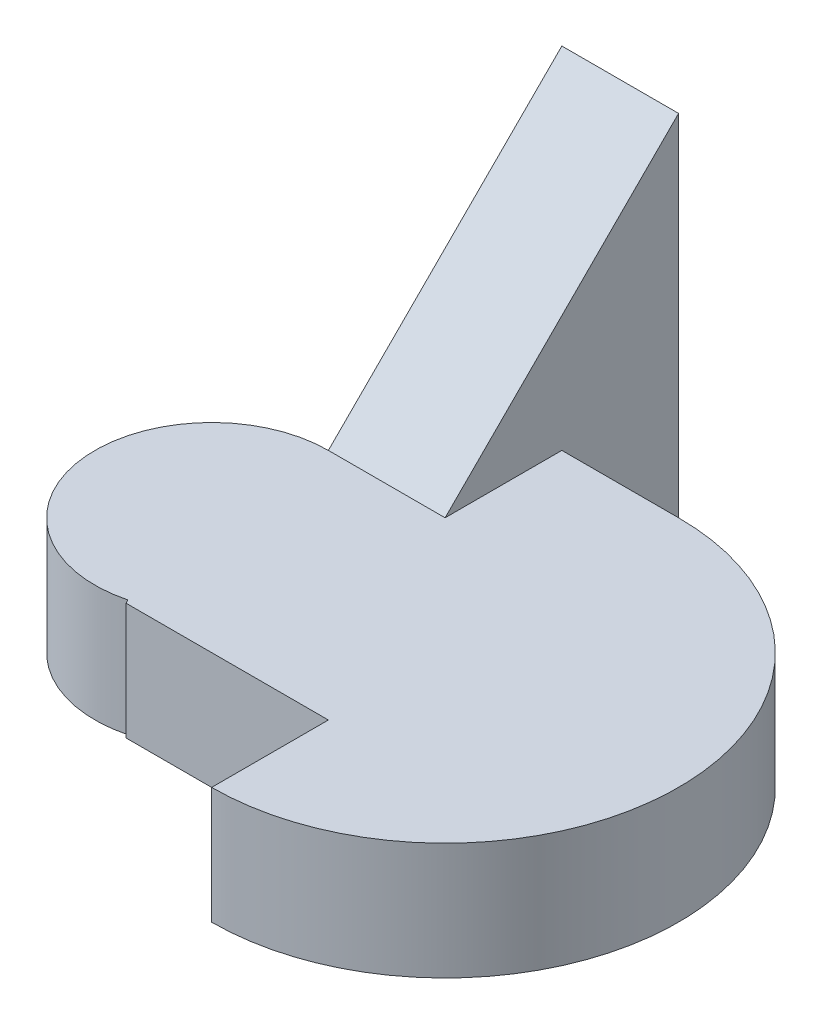
ISO-10303-21;
HEADER;
FILE_DESCRIPTION(('STEP AP214'),'2;1');
FILE_NAME('part.step','',(''),(''),'','','');
FILE_SCHEMA(('AUTOMOTIVE_DESIGN { 1 0 10303 214 1 1 1 1 }'));
ENDSEC;
DATA;
#1=APPLICATION_CONTEXT('core data for automotive mechanical design processes');
#2=APPLICATION_PROTOCOL_DEFINITION('international standard','automotive_design',2000,#1);
#3=PRODUCT_CONTEXT('',#1,'mechanical');
#4=PRODUCT('Part','Part','',(#3));
#5=PRODUCT_RELATED_PRODUCT_CATEGORY('part','',(#4));
#6=PRODUCT_DEFINITION_FORMATION('','',#4);
#7=PRODUCT_DEFINITION_CONTEXT('part definition',#1,'design');
#8=PRODUCT_DEFINITION('design','',#6,#7);
#9=PRODUCT_DEFINITION_SHAPE('','',#8);
#10=(LENGTH_UNIT() NAMED_UNIT(*) SI_UNIT(.MILLI.,.METRE.));
#11=(NAMED_UNIT(*) PLANE_ANGLE_UNIT() SI_UNIT($,.RADIAN.));
#12=(NAMED_UNIT(*) SI_UNIT($,.STERADIAN.) SOLID_ANGLE_UNIT());
#13=UNCERTAINTY_MEASURE_WITH_UNIT(LENGTH_MEASURE(1.E-05),#10,'distance_accuracy_value','');
#14=(GEOMETRIC_REPRESENTATION_CONTEXT(3) GLOBAL_UNCERTAINTY_ASSIGNED_CONTEXT((#13)) GLOBAL_UNIT_ASSIGNED_CONTEXT((#10,
#11,#12)) REPRESENTATION_CONTEXT('',''));
#15=CARTESIAN_POINT('',(0.,0.,0.));
#16=DIRECTION('',(0.,0.,1.));
#17=DIRECTION('',(1.,0.,0.));
#18=AXIS2_PLACEMENT_3D('',#15,#16,#17);
#19=CARTESIAN_POINT('',(-10.,10.,10.));
#20=DIRECTION('',(0.,-1.,0.));
#21=DIRECTION('',(0.,0.,-1.));
#22=AXIS2_PLACEMENT_3D('',#19,#20,#21);
#23=CYLINDRICAL_SURFACE('',#22,10.);
#24=CARTESIAN_POINT('',(-10.,0.,10.));
#25=DIRECTION('',(0.,1.,0.));
#26=DIRECTION('',(0.,0.,1.));
#27=AXIS2_PLACEMENT_3D('',#24,#25,#26);
#28=CIRCLE('',#27,10.);
#29=CARTESIAN_POINT('',(-10.,0.,0.));
#30=VERTEX_POINT('',#29);
#31=CARTESIAN_POINT('',(-7.5,0.,19.6824583655185));
#32=VERTEX_POINT('',#31);
#33=EDGE_CURVE('E129',#30,#32,#28,.T.);
#34=ORIENTED_EDGE('',*,*,#33,.T.);
#35=DIRECTION('',(0.,-1.,0.));
#36=VECTOR('',#35,1.);
#37=CARTESIAN_POINT('',(-7.5,10.,19.6824583655185));
#38=LINE('',#37,#36);
#39=CARTESIAN_POINT('',(-7.5,10.,19.6824583655185));
#40=VERTEX_POINT('',#39);
#41=EDGE_CURVE('E11',#40,#32,#38,.T.);
#42=ORIENTED_EDGE('',*,*,#41,.F.);
#43=CARTESIAN_POINT('',(-10.,10.,10.));
#44=DIRECTION('',(0.,1.,0.));
#45=DIRECTION('',(0.,0.,1.));
#46=AXIS2_PLACEMENT_3D('',#43,#44,#45);
#47=CIRCLE('',#46,10.);
#48=CARTESIAN_POINT('',(-10.,10.,0.));
#49=VERTEX_POINT('',#48);
#50=EDGE_CURVE('E141',#49,#40,#47,.T.);
#51=ORIENTED_EDGE('',*,*,#50,.F.);
#52=DIRECTION('',(0.,-1.,0.));
#53=VECTOR('',#52,1.);
#54=CARTESIAN_POINT('',(-10.,10.,0.));
#55=LINE('',#54,#53);
#56=EDGE_CURVE('E128',#49,#30,#55,.T.);
#57=ORIENTED_EDGE('',*,*,#56,.T.);
#58=EDGE_LOOP('',(#34,#42,#51,#57));
#59=FACE_BOUND('',#58,.T.);
#60=ADVANCED_FACE('F35',(#59),#23,.T.);
#61=CARTESIAN_POINT('',(10.,10.,10.));
#62=DIRECTION('',(0.,-1.,0.));
#63=DIRECTION('',(0.,0.,-1.));
#64=AXIS2_PLACEMENT_3D('',#61,#62,#63);
#65=CYLINDRICAL_SURFACE('',#64,20.);
#66=CARTESIAN_POINT('',(10.,0.,10.));
#67=DIRECTION('',(0.,1.,0.));
#68=DIRECTION('',(0.,0.,1.));
#69=AXIS2_PLACEMENT_3D('',#66,#67,#68);
#70=CIRCLE('',#69,20.);
#71=CARTESIAN_POINT('',(-7.32050807568877,0.,20.));
#72=VERTEX_POINT('',#71);
#73=EDGE_CURVE('E132',#32,#72,#70,.T.);
#74=ORIENTED_EDGE('',*,*,#73,.T.);
#75=DIRECTION('',(0.,-1.,0.));
#76=VECTOR('',#75,1.);
#77=CARTESIAN_POINT('',(-7.32050807568877,10.,20.));
#78=LINE('',#77,#76);
#79=CARTESIAN_POINT('',(-7.32050807568877,10.,20.));
#80=VERTEX_POINT('',#79);
#81=EDGE_CURVE('E43',#80,#72,#78,.T.);
#82=ORIENTED_EDGE('',*,*,#81,.F.);
#83=CARTESIAN_POINT('',(10.,10.,10.));
#84=DIRECTION('',(0.,1.,0.));
#85=DIRECTION('',(0.,0.,1.));
#86=AXIS2_PLACEMENT_3D('',#83,#84,#85);
#87=CIRCLE('',#86,20.);
#88=EDGE_CURVE('E84',#40,#80,#87,.T.);
#89=ORIENTED_EDGE('',*,*,#88,.F.);
#90=ORIENTED_EDGE('',*,*,#41,.T.);
#91=EDGE_LOOP('',(#74,#82,#89,#90));
#92=FACE_BOUND('',#91,.T.);
#93=ADVANCED_FACE('F186',(#92),#65,.T.);
#94=CARTESIAN_POINT('',(0.,10.,20.));
#95=DIRECTION('',(0.,0.,-1.));
#96=DIRECTION('',(-1.,0.,0.));
#97=AXIS2_PLACEMENT_3D('',#94,#95,#96);
#98=PLANE('',#97);
#99=DIRECTION('',(1.,0.,0.));
#100=VECTOR('',#99,1.);
#101=CARTESIAN_POINT('',(0.,0.,20.));
#102=LINE('',#101,#100);
#103=CARTESIAN_POINT('',(10.,0.,20.));
#104=VERTEX_POINT('',#103);
#105=EDGE_CURVE('E135',#72,#104,#102,.T.);
#106=ORIENTED_EDGE('',*,*,#105,.T.);
#107=DIRECTION('',(0.,-1.,0.));
#108=VECTOR('',#107,1.);
#109=CARTESIAN_POINT('',(10.,10.,20.));
#110=LINE('',#109,#108);
#111=CARTESIAN_POINT('',(10.,10.,20.));
#112=VERTEX_POINT('',#111);
#113=EDGE_CURVE('E114',#112,#104,#110,.T.);
#114=ORIENTED_EDGE('',*,*,#113,.F.);
#115=DIRECTION('',(1.,0.,0.));
#116=VECTOR('',#115,1.);
#117=CARTESIAN_POINT('',(0.,10.,20.));
#118=LINE('',#117,#116);
#119=EDGE_CURVE('E102',#80,#112,#118,.T.);
#120=ORIENTED_EDGE('',*,*,#119,.F.);
#121=ORIENTED_EDGE('',*,*,#81,.T.);
#122=EDGE_LOOP('',(#106,#114,#120,#121));
#123=FACE_BOUND('',#122,.T.);
#124=ADVANCED_FACE('F149',(#123),#98,.F.);
#125=CARTESIAN_POINT('',(10.,10.,0.));
#126=DIRECTION('',(1.,0.,0.));
#127=DIRECTION('',(0.,0.,-1.));
#128=AXIS2_PLACEMENT_3D('',#125,#126,#127);
#129=PLANE('',#128);
#130=DIRECTION('',(0.,0.,1.));
#131=VECTOR('',#130,1.);
#132=CARTESIAN_POINT('',(10.,0.,0.));
#133=LINE('',#132,#131);
#134=CARTESIAN_POINT('',(10.,0.,30.));
#135=VERTEX_POINT('',#134);
#136=EDGE_CURVE('E111',#104,#135,#133,.T.);
#137=ORIENTED_EDGE('',*,*,#136,.T.);
#138=DIRECTION('',(0.,-1.,0.));
#139=VECTOR('',#138,1.);
#140=CARTESIAN_POINT('',(10.,10.,30.));
#141=LINE('',#140,#139);
#142=CARTESIAN_POINT('',(10.,10.,30.));
#143=VERTEX_POINT('',#142);
#144=EDGE_CURVE('E108',#143,#135,#141,.T.);
#145=ORIENTED_EDGE('',*,*,#144,.F.);
#146=DIRECTION('',(0.,0.,1.));
#147=VECTOR('',#146,1.);
#148=CARTESIAN_POINT('',(10.,10.,0.));
#149=LINE('',#148,#147);
#150=EDGE_CURVE('E96',#112,#143,#149,.T.);
#151=ORIENTED_EDGE('',*,*,#150,.F.);
#152=ORIENTED_EDGE('',*,*,#113,.T.);
#153=EDGE_LOOP('',(#137,#145,#151,#152));
#154=FACE_BOUND('',#153,.T.);
#155=ADVANCED_FACE('F109',(#154),#129,.F.);
#156=CARTESIAN_POINT('',(10.,10.,10.));
#157=DIRECTION('',(0.,-1.,0.));
#158=DIRECTION('',(0.,0.,-1.));
#159=AXIS2_PLACEMENT_3D('',#156,#157,#158);
#160=CYLINDRICAL_SURFACE('',#159,20.);
#161=CARTESIAN_POINT('',(10.,0.,10.));
#162=DIRECTION('',(0.,1.,0.));
#163=DIRECTION('',(0.,0.,1.));
#164=AXIS2_PLACEMENT_3D('',#161,#162,#163);
#165=CIRCLE('',#164,20.);
#166=CARTESIAN_POINT('',(10.,0.,-10.));
#167=VERTEX_POINT('',#166);
#168=EDGE_CURVE('E138',#135,#167,#165,.T.);
#169=ORIENTED_EDGE('',*,*,#168,.T.);
#170=DIRECTION('',(0.,-1.,0.));
#171=VECTOR('',#170,1.);
#172=CARTESIAN_POINT('',(10.,10.,-10.));
#173=LINE('',#172,#171);
#174=CARTESIAN_POINT('',(10.,10.,-10.));
#175=VERTEX_POINT('',#174);
#176=EDGE_CURVE('E73',#175,#167,#173,.T.);
#177=ORIENTED_EDGE('',*,*,#176,.F.);
#178=CARTESIAN_POINT('',(10.,10.,10.));
#179=DIRECTION('',(0.,1.,0.));
#180=DIRECTION('',(0.,0.,1.));
#181=AXIS2_PLACEMENT_3D('',#178,#179,#180);
#182=CIRCLE('',#181,20.);
#183=EDGE_CURVE('E100',#143,#175,#182,.T.);
#184=ORIENTED_EDGE('',*,*,#183,.F.);
#185=ORIENTED_EDGE('',*,*,#144,.T.);
#186=EDGE_LOOP('',(#169,#177,#184,#185));
#187=FACE_BOUND('',#186,.T.);
#188=ADVANCED_FACE('F116',(#187),#160,.T.);
#189=CARTESIAN_POINT('',(0.,10.,-10.));
#190=DIRECTION('',(0.,0.,-1.));
#191=DIRECTION('',(-1.,0.,0.));
#192=AXIS2_PLACEMENT_3D('',#189,#190,#191);
#193=PLANE('',#192);
#194=DIRECTION('',(1.,0.,0.));
#195=VECTOR('',#194,1.);
#196=CARTESIAN_POINT('',(0.,0.,-10.));
#197=LINE('',#196,#195);
#198=CARTESIAN_POINT('',(0.,0.,-10.));
#199=VERTEX_POINT('',#198);
#200=EDGE_CURVE('E77',#199,#167,#197,.T.);
#201=ORIENTED_EDGE('',*,*,#200,.F.);
#202=DIRECTION('',(0.,-1.,0.));
#203=VECTOR('',#202,1.);
#204=CARTESIAN_POINT('',(0.,10.,-10.));
#205=LINE('',#204,#203);
#206=CARTESIAN_POINT('',(0.,10.,-10.));
#207=VERTEX_POINT('',#206);
#208=EDGE_CURVE('E51',#207,#199,#205,.T.);
#209=ORIENTED_EDGE('',*,*,#208,.F.);
#210=DIRECTION('',(1.,0.,0.));
#211=VECTOR('',#210,1.);
#212=CARTESIAN_POINT('',(0.,10.,-10.));
#213=LINE('',#212,#211);
#214=EDGE_CURVE('E117',#207,#175,#213,.T.);
#215=ORIENTED_EDGE('',*,*,#214,.T.);
#216=ORIENTED_EDGE('',*,*,#176,.T.);
#217=EDGE_LOOP('',(#201,#209,#215,#216));
#218=FACE_BOUND('',#217,.T.);
#219=ADVANCED_FACE('F198',(#218),#193,.T.);
#220=CARTESIAN_POINT('',(0.,10.,0.));
#221=DIRECTION('',(0.,1.,0.));
#222=DIRECTION('',(0.,0.,1.));
#223=AXIS2_PLACEMENT_3D('',#220,#221,#222);
#224=PLANE('',#223);
#225=ORIENTED_EDGE('',*,*,#50,.T.);
#226=ORIENTED_EDGE('',*,*,#88,.T.);
#227=ORIENTED_EDGE('',*,*,#119,.T.);
#228=ORIENTED_EDGE('',*,*,#150,.T.);
#229=ORIENTED_EDGE('',*,*,#183,.T.);
#230=ORIENTED_EDGE('',*,*,#214,.F.);
#231=DIRECTION('',(0.,0.,-1.));
#232=VECTOR('',#231,1.);
#233=CARTESIAN_POINT('',(0.,10.,0.));
#234=LINE('',#233,#232);
#235=CARTESIAN_POINT('',(0.,10.,0.));
#236=VERTEX_POINT('',#235);
#237=EDGE_CURVE('E119',#236,#207,#234,.T.);
#238=ORIENTED_EDGE('',*,*,#237,.F.);
#239=DIRECTION('',(-1.,0.,0.));
#240=VECTOR('',#239,1.);
#241=CARTESIAN_POINT('',(0.,10.,0.));
#242=LINE('',#241,#240);
#243=EDGE_CURVE('E125',#236,#49,#242,.T.);
#244=ORIENTED_EDGE('',*,*,#243,.T.);
#245=EDGE_LOOP('',(#225,#226,#227,#228,#229,#230,#238,#244));
#246=FACE_BOUND('',#245,.T.);
#247=ADVANCED_FACE('F98',(#246),#224,.T.);
#248=CARTESIAN_POINT('',(0.,0.,0.));
#249=DIRECTION('',(0.,1.,0.));
#250=DIRECTION('',(0.,0.,1.));
#251=AXIS2_PLACEMENT_3D('',#248,#249,#250);
#252=PLANE('',#251);
#253=DIRECTION('',(0.,0.,1.));
#254=VECTOR('',#253,1.);
#255=CARTESIAN_POINT('',(0.,0.,-20.));
#256=LINE('',#255,#254);
#257=CARTESIAN_POINT('',(0.,0.,-20.));
#258=VERTEX_POINT('',#257);
#259=EDGE_CURVE('E156',#258,#199,#256,.T.);
#260=ORIENTED_EDGE('',*,*,#259,.T.);
#261=ORIENTED_EDGE('',*,*,#200,.T.);
#262=ORIENTED_EDGE('',*,*,#168,.F.);
#263=ORIENTED_EDGE('',*,*,#136,.F.);
#264=ORIENTED_EDGE('',*,*,#105,.F.);
#265=ORIENTED_EDGE('',*,*,#73,.F.);
#266=ORIENTED_EDGE('',*,*,#33,.F.);
#267=DIRECTION('',(0.,0.,-1.));
#268=VECTOR('',#267,1.);
#269=CARTESIAN_POINT('',(-10.,0.,0.));
#270=LINE('',#269,#268);
#271=CARTESIAN_POINT('',(-10.,0.,-20.));
#272=VERTEX_POINT('',#271);
#273=EDGE_CURVE('E162',#30,#272,#270,.T.);
#274=ORIENTED_EDGE('',*,*,#273,.T.);
#275=DIRECTION('',(1.,0.,0.));
#276=VECTOR('',#275,1.);
#277=CARTESIAN_POINT('',(-10.,0.,-20.));
#278=LINE('',#277,#276);
#279=EDGE_CURVE('E159',#272,#258,#278,.T.);
#280=ORIENTED_EDGE('',*,*,#279,.T.);
#281=EDGE_LOOP('',(#260,#261,#262,#263,#264,#265,#266,#274,#280));
#282=FACE_BOUND('',#281,.T.);
#283=ADVANCED_FACE('F152',(#282),#252,.F.);
#284=CARTESIAN_POINT('',(0.,30.,-20.));
#285=DIRECTION('',(1.,0.,0.));
#286=DIRECTION('',(0.,0.,-1.));
#287=AXIS2_PLACEMENT_3D('',#284,#285,#286);
#288=PLANE('',#287);
#289=DIRECTION('',(0.,0.707106781186547,-0.707106781186548));
#290=VECTOR('',#289,1.);
#291=CARTESIAN_POINT('',(0.,30.,-20.));
#292=LINE('',#291,#290);
#293=CARTESIAN_POINT('',(0.,30.,-20.));
#294=VERTEX_POINT('',#293);
#295=EDGE_CURVE('E167',#236,#294,#292,.T.);
#296=ORIENTED_EDGE('',*,*,#295,.F.);
#297=ORIENTED_EDGE('',*,*,#237,.T.);
#298=ORIENTED_EDGE('',*,*,#208,.T.);
#299=ORIENTED_EDGE('',*,*,#259,.F.);
#300=DIRECTION('',(0.,-1.,0.));
#301=VECTOR('',#300,1.);
#302=CARTESIAN_POINT('',(0.,30.,-20.));
#303=LINE('',#302,#301);
#304=EDGE_CURVE('E133',#294,#258,#303,.T.);
#305=ORIENTED_EDGE('',*,*,#304,.F.);
#306=EDGE_LOOP('',(#296,#297,#298,#299,#305));
#307=FACE_BOUND('',#306,.T.);
#308=ADVANCED_FACE('F203',(#307),#288,.T.);
#309=CARTESIAN_POINT('',(-10.,30.,-20.));
#310=DIRECTION('',(0.,0.,-1.));
#311=DIRECTION('',(-1.,0.,0.));
#312=AXIS2_PLACEMENT_3D('',#309,#310,#311);
#313=PLANE('',#312);
#314=ORIENTED_EDGE('',*,*,#279,.F.);
#315=DIRECTION('',(0.,-1.,0.));
#316=VECTOR('',#315,1.);
#317=CARTESIAN_POINT('',(-10.,30.,-20.));
#318=LINE('',#317,#316);
#319=CARTESIAN_POINT('',(-10.,30.,-20.));
#320=VERTEX_POINT('',#319);
#321=EDGE_CURVE('E175',#320,#272,#318,.T.);
#322=ORIENTED_EDGE('',*,*,#321,.F.);
#323=DIRECTION('',(1.,0.,0.));
#324=VECTOR('',#323,1.);
#325=CARTESIAN_POINT('',(-10.,30.,-20.));
#326=LINE('',#325,#324);
#327=EDGE_CURVE('E170',#320,#294,#326,.T.);
#328=ORIENTED_EDGE('',*,*,#327,.T.);
#329=ORIENTED_EDGE('',*,*,#304,.T.);
#330=EDGE_LOOP('',(#314,#322,#328,#329));
#331=FACE_BOUND('',#330,.T.);
#332=ADVANCED_FACE('F208',(#331),#313,.T.);
#333=CARTESIAN_POINT('',(-10.,30.,0.));
#334=DIRECTION('',(-1.,0.,0.));
#335=DIRECTION('',(0.,0.,1.));
#336=AXIS2_PLACEMENT_3D('',#333,#334,#335);
#337=PLANE('',#336);
#338=DIRECTION('',(0.,-0.707106781186547,0.707106781186548));
#339=VECTOR('',#338,1.);
#340=CARTESIAN_POINT('',(-10.,20.,-10.));
#341=LINE('',#340,#339);
#342=EDGE_CURVE('E163',#320,#49,#341,.T.);
#343=ORIENTED_EDGE('',*,*,#342,.F.);
#344=ORIENTED_EDGE('',*,*,#321,.T.);
#345=ORIENTED_EDGE('',*,*,#273,.F.);
#346=ORIENTED_EDGE('',*,*,#56,.F.);
#347=EDGE_LOOP('',(#343,#344,#345,#346));
#348=FACE_BOUND('',#347,.T.);
#349=ADVANCED_FACE('F209',(#348),#337,.T.);
#350=CARTESIAN_POINT('',(-30.,30.,-20.));
#351=DIRECTION('',(0.,-0.707106781186548,-0.707106781186547));
#352=DIRECTION('',(0.,0.707106781186547,-0.707106781186548));
#353=AXIS2_PLACEMENT_3D('',#350,#351,#352);
#354=PLANE('',#353);
#355=ORIENTED_EDGE('',*,*,#342,.T.);
#356=ORIENTED_EDGE('',*,*,#243,.F.);
#357=ORIENTED_EDGE('',*,*,#295,.T.);
#358=ORIENTED_EDGE('',*,*,#327,.F.);
#359=EDGE_LOOP('',(#355,#356,#357,#358));
#360=FACE_BOUND('',#359,.T.);
#361=ADVANCED_FACE('F212',(#360),#354,.F.);
#362=CLOSED_SHELL('',(#60,#93,#124,#155,#188,#219,#247,#283,#308,#332,#349,#361));
#363=MANIFOLD_SOLID_BREP('B2',#362);
#364=ADVANCED_BREP_SHAPE_REPRESENTATION('',(#18,#363),#14);
#365=SHAPE_DEFINITION_REPRESENTATION(#9,#364);
ENDSEC;
END-ISO-10303-21;
